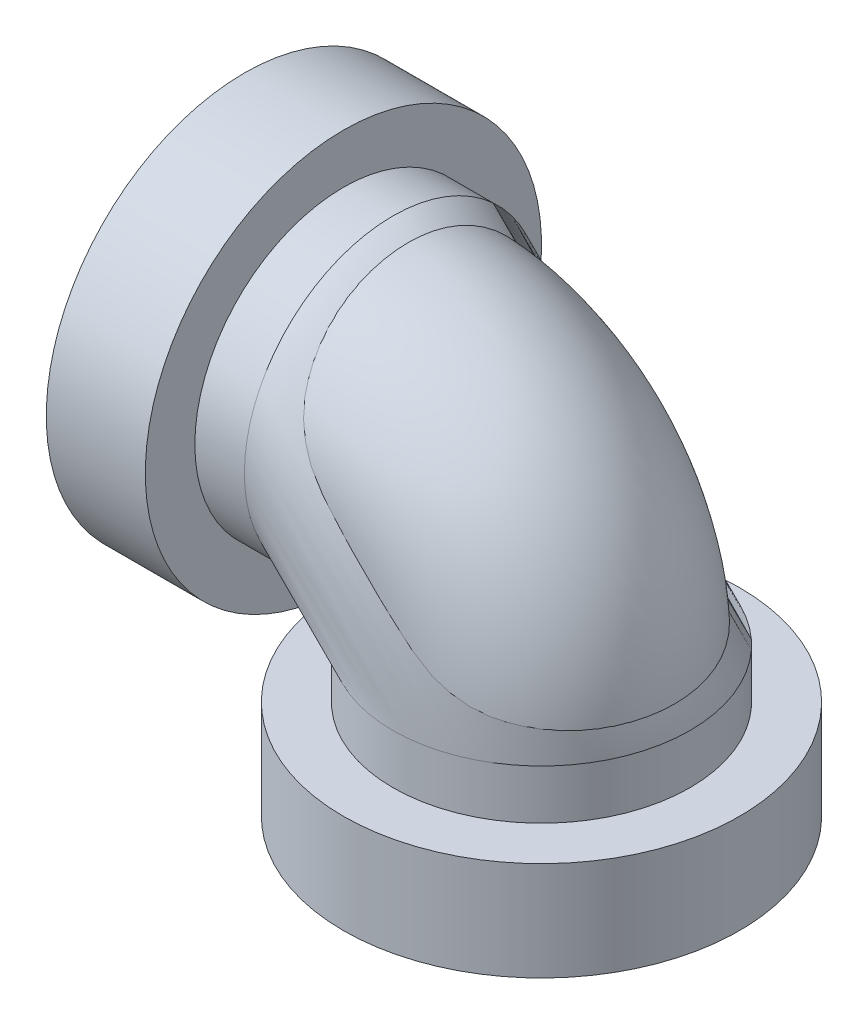
ISO-10303-21;
HEADER;
FILE_DESCRIPTION(('STEP AP214'),'2;1');
FILE_NAME('part.step','',(''),(''),'','','');
FILE_SCHEMA(('AUTOMOTIVE_DESIGN { 1 0 10303 214 1 1 1 1 }'));
ENDSEC;
DATA;
#1=APPLICATION_CONTEXT('core data for automotive mechanical design processes');
#2=APPLICATION_PROTOCOL_DEFINITION('international standard','automotive_design',2000,#1);
#3=PRODUCT_CONTEXT('',#1,'mechanical');
#4=PRODUCT('Part','Part','',(#3));
#5=PRODUCT_RELATED_PRODUCT_CATEGORY('part','',(#4));
#6=PRODUCT_DEFINITION_FORMATION('','',#4);
#7=PRODUCT_DEFINITION_CONTEXT('part definition',#1,'design');
#8=PRODUCT_DEFINITION('design','',#6,#7);
#9=PRODUCT_DEFINITION_SHAPE('','',#8);
#10=(LENGTH_UNIT() NAMED_UNIT(*) SI_UNIT(.MILLI.,.METRE.));
#11=(NAMED_UNIT(*) PLANE_ANGLE_UNIT() SI_UNIT($,.RADIAN.));
#12=(NAMED_UNIT(*) SI_UNIT($,.STERADIAN.) SOLID_ANGLE_UNIT());
#13=UNCERTAINTY_MEASURE_WITH_UNIT(LENGTH_MEASURE(1.E-05),#10,'distance_accuracy_value','');
#14=(GEOMETRIC_REPRESENTATION_CONTEXT(3) GLOBAL_UNCERTAINTY_ASSIGNED_CONTEXT((#13)) GLOBAL_UNIT_ASSIGNED_CONTEXT((#10,
#11,#12)) REPRESENTATION_CONTEXT('',''));
#15=CARTESIAN_POINT('',(0.,0.,0.));
#16=DIRECTION('',(0.,0.,1.));
#17=DIRECTION('',(1.,0.,0.));
#18=AXIS2_PLACEMENT_3D('',#15,#16,#17);
#19=CARTESIAN_POINT('',(-20.,30.,0.));
#20=DIRECTION('',(-1.,0.,0.));
#21=DIRECTION('',(0.,-1.,0.));
#22=AXIS2_PLACEMENT_3D('',#19,#20,#21);
#23=CYLINDRICAL_SURFACE('',#22,20.);
#24=CARTESIAN_POINT('',(-20.,30.,0.));
#25=DIRECTION('',(-1.,0.,0.));
#26=DIRECTION('',(0.,-1.,0.));
#27=AXIS2_PLACEMENT_3D('',#24,#25,#26);
#28=CIRCLE('',#27,20.);
#29=CARTESIAN_POINT('',(-20.,10.,0.));
#30=VERTEX_POINT('',#29);
#31=EDGE_CURVE('E12',#30,#30,#28,.T.);
#32=ORIENTED_EDGE('',*,*,#31,.T.);
#33=EDGE_LOOP('',(#32));
#34=FACE_BOUND('',#33,.T.);
#35=CARTESIAN_POINT('',(-30.,30.,0.));
#36=DIRECTION('',(-1.,0.,0.));
#37=DIRECTION('',(0.,-1.,0.));
#38=AXIS2_PLACEMENT_3D('',#35,#36,#37);
#39=CIRCLE('',#38,20.);
#40=CARTESIAN_POINT('',(-30.,9.99999999999999,0.));
#41=VERTEX_POINT('',#40);
#42=EDGE_CURVE('E74',#41,#41,#39,.T.);
#43=ORIENTED_EDGE('',*,*,#42,.F.);
#44=EDGE_LOOP('',(#43));
#45=FACE_BOUND('',#44,.T.);
#46=ADVANCED_FACE('F71',(#34,#45),#23,.T.);
#47=CARTESIAN_POINT('',(-20.,30.,0.));
#48=DIRECTION('',(-1.,0.,0.));
#49=DIRECTION('',(0.,-1.,0.));
#50=AXIS2_PLACEMENT_3D('',#47,#48,#49);
#51=PLANE('',#50);
#52=CARTESIAN_POINT('',(-20.,30.,0.));
#53=DIRECTION('',(-1.,0.,0.));
#54=DIRECTION('',(0.,-1.,0.));
#55=AXIS2_PLACEMENT_3D('',#52,#53,#54);
#56=CIRCLE('',#55,15.);
#57=CARTESIAN_POINT('',(-20.,15.,0.));
#58=VERTEX_POINT('',#57);
#59=EDGE_CURVE('E81',#58,#58,#56,.T.);
#60=ORIENTED_EDGE('',*,*,#59,.T.);
#61=EDGE_LOOP('',(#60));
#62=FACE_BOUND('',#61,.T.);
#63=ORIENTED_EDGE('',*,*,#31,.F.);
#64=EDGE_LOOP('',(#63));
#65=FACE_BOUND('',#64,.T.);
#66=ADVANCED_FACE('F89',(#62,#65),#51,.F.);
#67=CARTESIAN_POINT('',(-30.,30.,0.));
#68=DIRECTION('',(-1.,0.,0.));
#69=DIRECTION('',(0.,-1.,0.));
#70=AXIS2_PLACEMENT_3D('',#67,#68,#69);
#71=PLANE('',#70);
#72=CARTESIAN_POINT('',(-30.,30.,0.));
#73=DIRECTION('',(-1.,0.,0.));
#74=DIRECTION('',(0.,-1.,0.));
#75=AXIS2_PLACEMENT_3D('',#72,#73,#74);
#76=CIRCLE('',#75,15.);
#77=CARTESIAN_POINT('',(-30.,15.,0.));
#78=VERTEX_POINT('',#77);
#79=EDGE_CURVE('E83',#78,#78,#76,.T.);
#80=ORIENTED_EDGE('',*,*,#79,.F.);
#81=EDGE_LOOP('',(#80));
#82=FACE_BOUND('',#81,.T.);
#83=ORIENTED_EDGE('',*,*,#42,.T.);
#84=EDGE_LOOP('',(#83));
#85=FACE_BOUND('',#84,.T.);
#86=ADVANCED_FACE('F95',(#82,#85),#71,.T.);
#87=CARTESIAN_POINT('',(-20.,30.,0.));
#88=DIRECTION('',(-1.,0.,0.));
#89=DIRECTION('',(0.,-1.,0.));
#90=AXIS2_PLACEMENT_3D('',#87,#88,#89);
#91=CYLINDRICAL_SURFACE('',#90,15.);
#92=ORIENTED_EDGE('',*,*,#59,.F.);
#93=EDGE_LOOP('',(#92));
#94=FACE_BOUND('',#93,.T.);
#95=ORIENTED_EDGE('',*,*,#79,.T.);
#96=EDGE_LOOP('',(#95));
#97=FACE_BOUND('',#96,.T.);
#98=ADVANCED_FACE('F92',(#94,#97),#91,.F.);
#99=CLOSED_SHELL('',(#46,#66,#86,#98));
#100=MANIFOLD_SOLID_BREP('B2',#99);
#101=CARTESIAN_POINT('',(0.,10.,0.));
#102=DIRECTION('',(0.,-1.,0.));
#103=DIRECTION('',(0.,0.,-1.));
#104=AXIS2_PLACEMENT_3D('',#101,#102,#103);
#105=CYLINDRICAL_SURFACE('',#104,15.);
#106=CARTESIAN_POINT('',(0.,10.,0.));
#107=DIRECTION('',(0.,1.,0.));
#108=DIRECTION('',(0.,0.,1.));
#109=AXIS2_PLACEMENT_3D('',#106,#107,#108);
#110=CIRCLE('',#109,15.);
#111=CARTESIAN_POINT('',(0.,10.,15.));
#112=VERTEX_POINT('',#111);
#113=EDGE_CURVE('E150',#112,#112,#110,.T.);
#114=ORIENTED_EDGE('',*,*,#113,.T.);
#115=EDGE_LOOP('',(#114));
#116=FACE_BOUND('',#115,.T.);
#117=CARTESIAN_POINT('',(0.,0.,0.));
#118=DIRECTION('',(0.,1.,0.));
#119=DIRECTION('',(0.,0.,1.));
#120=AXIS2_PLACEMENT_3D('',#117,#118,#119);
#121=CIRCLE('',#120,15.);
#122=CARTESIAN_POINT('',(0.,0.,15.));
#123=VERTEX_POINT('',#122);
#124=EDGE_CURVE('E156',#123,#123,#121,.T.);
#125=ORIENTED_EDGE('',*,*,#124,.F.);
#126=EDGE_LOOP('',(#125));
#127=FACE_BOUND('',#126,.T.);
#128=ADVANCED_FACE('F143',(#116,#127),#105,.F.);
#129=CARTESIAN_POINT('',(0.,10.,0.));
#130=DIRECTION('',(0.,-1.,0.));
#131=DIRECTION('',(0.,0.,-1.));
#132=AXIS2_PLACEMENT_3D('',#129,#130,#131);
#133=CYLINDRICAL_SURFACE('',#132,20.);
#134=CARTESIAN_POINT('',(0.,10.,0.));
#135=DIRECTION('',(0.,1.,0.));
#136=DIRECTION('',(0.,0.,1.));
#137=AXIS2_PLACEMENT_3D('',#134,#135,#136);
#138=CIRCLE('',#137,20.);
#139=CARTESIAN_POINT('',(0.,10.,20.));
#140=VERTEX_POINT('',#139);
#141=EDGE_CURVE('E70',#140,#140,#138,.T.);
#142=ORIENTED_EDGE('',*,*,#141,.F.);
#143=EDGE_LOOP('',(#142));
#144=FACE_BOUND('',#143,.T.);
#145=CARTESIAN_POINT('',(0.,0.,0.));
#146=DIRECTION('',(0.,1.,0.));
#147=DIRECTION('',(0.,0.,1.));
#148=AXIS2_PLACEMENT_3D('',#145,#146,#147);
#149=CIRCLE('',#148,20.);
#150=CARTESIAN_POINT('',(0.,0.,20.));
#151=VERTEX_POINT('',#150);
#152=EDGE_CURVE('E146',#151,#151,#149,.T.);
#153=ORIENTED_EDGE('',*,*,#152,.T.);
#154=EDGE_LOOP('',(#153));
#155=FACE_BOUND('',#154,.T.);
#156=ADVANCED_FACE('F163',(#144,#155),#133,.T.);
#157=CARTESIAN_POINT('',(0.,10.,0.));
#158=DIRECTION('',(0.,1.,0.));
#159=DIRECTION('',(0.,0.,1.));
#160=AXIS2_PLACEMENT_3D('',#157,#158,#159);
#161=PLANE('',#160);
#162=ORIENTED_EDGE('',*,*,#113,.F.);
#163=EDGE_LOOP('',(#162));
#164=FACE_BOUND('',#163,.T.);
#165=ORIENTED_EDGE('',*,*,#141,.T.);
#166=EDGE_LOOP('',(#165));
#167=FACE_BOUND('',#166,.T.);
#168=ADVANCED_FACE('F167',(#164,#167),#161,.T.);
#169=CARTESIAN_POINT('',(0.,0.,0.));
#170=DIRECTION('',(0.,1.,0.));
#171=DIRECTION('',(0.,0.,1.));
#172=AXIS2_PLACEMENT_3D('',#169,#170,#171);
#173=PLANE('',#172);
#174=ORIENTED_EDGE('',*,*,#124,.T.);
#175=EDGE_LOOP('',(#174));
#176=FACE_BOUND('',#175,.T.);
#177=ORIENTED_EDGE('',*,*,#152,.F.);
#178=EDGE_LOOP('',(#177));
#179=FACE_BOUND('',#178,.T.);
#180=ADVANCED_FACE('F165',(#176,#179),#173,.F.);
#181=CLOSED_SHELL('',(#128,#156,#168,#180));
#182=MANIFOLD_SOLID_BREP('B7',#181);
#183=CARTESIAN_POINT('',(0.,0.,0.));
#184=DIRECTION('',(0.,-1.,0.));
#185=DIRECTION('',(1.,0.,0.));
#186=AXIS2_PLACEMENT_3D('',#183,#184,#185);
#187=PLANE('',#186);
#188=CARTESIAN_POINT('',(0.,0.,0.));
#189=DIRECTION('',(0.,-1.,0.));
#190=DIRECTION('',(1.,0.,0.));
#191=AXIS2_PLACEMENT_3D('',#188,#189,#190);
#192=CIRCLE('',#191,13.5);
#193=CARTESIAN_POINT('',(13.5,0.,0.));
#194=VERTEX_POINT('',#193);
#195=EDGE_CURVE('E230',#194,#194,#192,.T.);
#196=ORIENTED_EDGE('',*,*,#195,.F.);
#197=EDGE_LOOP('',(#196));
#198=FACE_BOUND('',#197,.T.);
#199=CARTESIAN_POINT('',(0.,0.,0.));
#200=DIRECTION('',(0.,-1.,0.));
#201=DIRECTION('',(1.,0.,0.));
#202=AXIS2_PLACEMENT_3D('',#199,#200,#201);
#203=CIRCLE('',#202,15.);
#204=CARTESIAN_POINT('',(15.,0.,0.));
#205=VERTEX_POINT('',#204);
#206=EDGE_CURVE('E216',#205,#205,#203,.T.);
#207=ORIENTED_EDGE('',*,*,#206,.T.);
#208=EDGE_LOOP('',(#207));
#209=FACE_BOUND('',#208,.T.);
#210=ADVANCED_FACE('F204',(#198,#209),#187,.T.);
#211=CARTESIAN_POINT('',(-30.,30.,0.));
#212=DIRECTION('',(1.,0.,0.));
#213=DIRECTION('',(0.,1.,0.));
#214=AXIS2_PLACEMENT_3D('',#211,#212,#213);
#215=PLANE('',#214);
#216=CARTESIAN_POINT('',(-30.,30.,0.));
#217=DIRECTION('',(1.,0.,0.));
#218=DIRECTION('',(0.,1.,0.));
#219=AXIS2_PLACEMENT_3D('',#216,#217,#218);
#220=CIRCLE('',#219,13.5);
#221=CARTESIAN_POINT('',(-30.,43.5,0.));
#222=VERTEX_POINT('',#221);
#223=EDGE_CURVE('E235',#222,#222,#220,.T.);
#224=ORIENTED_EDGE('',*,*,#223,.T.);
#225=EDGE_LOOP('',(#224));
#226=FACE_BOUND('',#225,.T.);
#227=CARTESIAN_POINT('',(-30.,30.,0.));
#228=DIRECTION('',(1.,0.,0.));
#229=DIRECTION('',(0.,1.,0.));
#230=AXIS2_PLACEMENT_3D('',#227,#228,#229);
#231=CIRCLE('',#230,15.);
#232=CARTESIAN_POINT('',(-30.,45.,0.));
#233=VERTEX_POINT('',#232);
#234=EDGE_CURVE('E141',#233,#233,#231,.T.);
#235=ORIENTED_EDGE('',*,*,#234,.F.);
#236=EDGE_LOOP('',(#235));
#237=FACE_BOUND('',#236,.T.);
#238=ADVANCED_FACE('F245',(#226,#237),#215,.F.);
#239=CARTESIAN_POINT('',(0.,0.,0.));
#240=DIRECTION('',(0.,1.,0.));
#241=DIRECTION('',(-1.,0.,0.));
#242=AXIS2_PLACEMENT_3D('',#239,#240,#241);
#243=CYLINDRICAL_SURFACE('',#242,15.);
#244=CARTESIAN_POINT('',(0.,15.,0.));
#245=DIRECTION('',(0.,-1.,0.));
#246=DIRECTION('',(1.,0.,0.));
#247=AXIS2_PLACEMENT_3D('',#244,#245,#246);
#248=CIRCLE('',#247,15.);
#249=CARTESIAN_POINT('',(-15.,15.,0.));
#250=VERTEX_POINT('',#249);
#251=EDGE_CURVE('E225',#250,#250,#248,.T.);
#252=ORIENTED_EDGE('',*,*,#251,.T.);
#253=EDGE_LOOP('',(#252));
#254=FACE_BOUND('',#253,.T.);
#255=ORIENTED_EDGE('',*,*,#206,.F.);
#256=EDGE_LOOP('',(#255));
#257=FACE_BOUND('',#256,.T.);
#258=ADVANCED_FACE('F272',(#254,#257),#243,.T.);
#259=CARTESIAN_POINT('',(-15.,15.,0.));
#260=DIRECTION('',(0.,0.,1.));
#261=DIRECTION('',(1.,0.,0.));
#262=AXIS2_PLACEMENT_3D('',#259,#260,#261);
#263=DEGENERATE_TOROIDAL_SURFACE('',#262,15.,15.,.T.);
#264=CARTESIAN_POINT('',(-15.,30.,0.));
#265=DIRECTION('',(1.,0.,0.));
#266=DIRECTION('',(0.,1.,0.));
#267=AXIS2_PLACEMENT_3D('',#264,#265,#266);
#268=CIRCLE('',#267,15.);
#269=EDGE_CURVE('E211',#250,#250,#268,.T.);
#270=ORIENTED_EDGE('',*,*,#269,.T.);
#271=ORIENTED_EDGE('',*,*,#251,.F.);
#272=EDGE_LOOP('',(#270,#271));
#273=FACE_BOUND('',#272,.T.);
#274=ADVANCED_FACE('F226',(#273),#263,.T.);
#275=CARTESIAN_POINT('',(-15.,30.,0.));
#276=DIRECTION('',(-1.,0.,0.));
#277=DIRECTION('',(0.,-1.,0.));
#278=AXIS2_PLACEMENT_3D('',#275,#276,#277);
#279=CYLINDRICAL_SURFACE('',#278,15.);
#280=ORIENTED_EDGE('',*,*,#234,.T.);
#281=EDGE_LOOP('',(#280));
#282=FACE_BOUND('',#281,.T.);
#283=ORIENTED_EDGE('',*,*,#269,.F.);
#284=EDGE_LOOP('',(#283));
#285=FACE_BOUND('',#284,.T.);
#286=ADVANCED_FACE('F263',(#282,#285),#279,.T.);
#287=CARTESIAN_POINT('',(0.,-1.,0.));
#288=DIRECTION('',(0.,1.,0.));
#289=DIRECTION('',(-1.,0.,0.));
#290=AXIS2_PLACEMENT_3D('',#287,#288,#289);
#291=CYLINDRICAL_SURFACE('',#290,13.5);
#292=CARTESIAN_POINT('',(0.,15.,0.));
#293=DIRECTION('',(0.,-1.,0.));
#294=DIRECTION('',(1.,0.,0.));
#295=AXIS2_PLACEMENT_3D('',#292,#293,#294);
#296=CIRCLE('',#295,13.5);
#297=CARTESIAN_POINT('',(13.5,15.,0.));
#298=VERTEX_POINT('',#297);
#299=EDGE_CURVE('E236',#298,#298,#296,.T.);
#300=ORIENTED_EDGE('',*,*,#299,.F.);
#301=EDGE_LOOP('',(#300));
#302=FACE_BOUND('',#301,.T.);
#303=ORIENTED_EDGE('',*,*,#195,.T.);
#304=EDGE_LOOP('',(#303));
#305=FACE_BOUND('',#304,.T.);
#306=ADVANCED_FACE('F253',(#302,#305),#291,.F.);
#307=CARTESIAN_POINT('',(-15.,15.,0.));
#308=DIRECTION('',(0.,0.,1.));
#309=DIRECTION('',(1.,0.,0.));
#310=AXIS2_PLACEMENT_3D('',#307,#308,#309);
#311=TOROIDAL_SURFACE('',#310,15.,13.5);
#312=CARTESIAN_POINT('',(-15.,30.,0.));
#313=DIRECTION('',(1.,0.,0.));
#314=DIRECTION('',(0.,1.,0.));
#315=AXIS2_PLACEMENT_3D('',#312,#313,#314);
#316=CIRCLE('',#315,13.5);
#317=CARTESIAN_POINT('',(-15.,43.5,0.));
#318=VERTEX_POINT('',#317);
#319=EDGE_CURVE('E239',#318,#318,#316,.T.);
#320=CARTESIAN_POINT('',(-15.,15.,0.));
#321=DIRECTION('',(0.,0.,1.));
#322=DIRECTION('',(1.,0.,0.));
#323=AXIS2_PLACEMENT_3D('',#320,#321,#322);
#324=CIRCLE('',#323,28.5);
#325=EDGE_CURVE('',#298,#318,#324,.T.);
#326=ORIENTED_EDGE('',*,*,#299,.T.);
#327=ORIENTED_EDGE('',*,*,#319,.F.);
#328=ORIENTED_EDGE('',*,*,#325,.T.);
#329=ORIENTED_EDGE('',*,*,#325,.F.);
#330=EDGE_LOOP('',(#326,#328,#327,#329));
#331=FACE_BOUND('',#330,.T.);
#332=ADVANCED_FACE('F251',(#331),#311,.F.);
#333=CARTESIAN_POINT('',(-15.,30.,0.));
#334=DIRECTION('',(-1.,0.,0.));
#335=DIRECTION('',(0.,-1.,0.));
#336=AXIS2_PLACEMENT_3D('',#333,#334,#335);
#337=CYLINDRICAL_SURFACE('',#336,13.5);
#338=ORIENTED_EDGE('',*,*,#223,.F.);
#339=EDGE_LOOP('',(#338));
#340=FACE_BOUND('',#339,.T.);
#341=ORIENTED_EDGE('',*,*,#319,.T.);
#342=EDGE_LOOP('',(#341));
#343=FACE_BOUND('',#342,.T.);
#344=ADVANCED_FACE('F248',(#340,#343),#337,.F.);
#345=CLOSED_SHELL('',(#210,#238,#258,#274,#286,#306,#332,#344));
#346=MANIFOLD_SOLID_BREP('B65',#345);
#347=ADVANCED_BREP_SHAPE_REPRESENTATION('',(#18,#100,#182,#346),#14);
#348=SHAPE_DEFINITION_REPRESENTATION(#9,#347);
ENDSEC;
END-ISO-10303-21;
